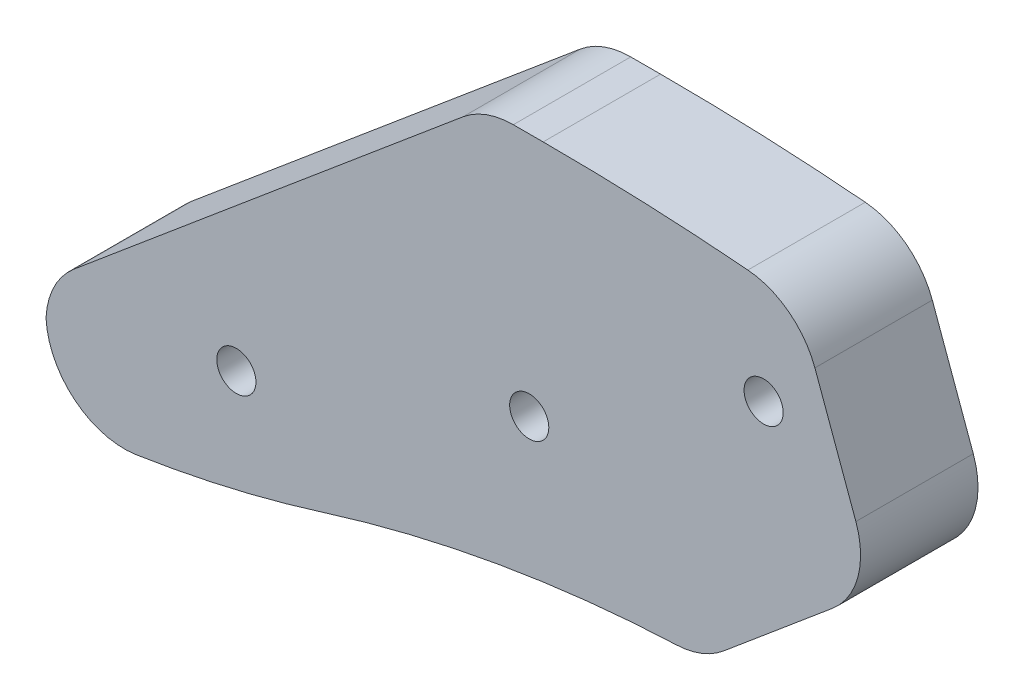
ISO-10303-21;
HEADER;
FILE_DESCRIPTION(('STEP AP214'),'2;1');
FILE_NAME('part.step','',(''),(''),'','','');
FILE_SCHEMA(('AUTOMOTIVE_DESIGN { 1 0 10303 214 1 1 1 1 }'));
ENDSEC;
DATA;
#1=APPLICATION_CONTEXT('core data for automotive mechanical design processes');
#2=APPLICATION_PROTOCOL_DEFINITION('international standard','automotive_design',2000,#1);
#3=PRODUCT_CONTEXT('',#1,'mechanical');
#4=PRODUCT('Part','Part','',(#3));
#5=PRODUCT_RELATED_PRODUCT_CATEGORY('part','',(#4));
#6=PRODUCT_DEFINITION_FORMATION('','',#4);
#7=PRODUCT_DEFINITION_CONTEXT('part definition',#1,'design');
#8=PRODUCT_DEFINITION('design','',#6,#7);
#9=PRODUCT_DEFINITION_SHAPE('','',#8);
#10=(LENGTH_UNIT() NAMED_UNIT(*) SI_UNIT(.MILLI.,.METRE.));
#11=(NAMED_UNIT(*) PLANE_ANGLE_UNIT() SI_UNIT($,.RADIAN.));
#12=(NAMED_UNIT(*) SI_UNIT($,.STERADIAN.) SOLID_ANGLE_UNIT());
#13=UNCERTAINTY_MEASURE_WITH_UNIT(LENGTH_MEASURE(1.E-05),#10,'distance_accuracy_value','');
#14=(GEOMETRIC_REPRESENTATION_CONTEXT(3) GLOBAL_UNCERTAINTY_ASSIGNED_CONTEXT((#13)) GLOBAL_UNIT_ASSIGNED_CONTEXT((#10,
#11,#12)) REPRESENTATION_CONTEXT('',''));
#15=CARTESIAN_POINT('',(0.,0.,0.));
#16=DIRECTION('',(0.,0.,1.));
#17=DIRECTION('',(1.,0.,0.));
#18=AXIS2_PLACEMENT_3D('',#15,#16,#17);
#19=CARTESIAN_POINT('',(0.,105.,-12.));
#20=DIRECTION('',(0.,0.,1.));
#21=DIRECTION('',(-1.,0.,0.));
#22=AXIS2_PLACEMENT_3D('',#19,#20,#21);
#23=CYLINDRICAL_SURFACE('',#22,130.);
#24=CARTESIAN_POINT('',(0.,105.,-12.));
#25=DIRECTION('',(0.,0.,1.));
#26=DIRECTION('',(1.,0.,0.));
#27=AXIS2_PLACEMENT_3D('',#24,#25,#26);
#28=CIRCLE('',#27,130.);
#29=CARTESIAN_POINT('',(38.9734253468667,-19.0204503972317,-12.));
#30=VERTEX_POINT('',#29);
#31=CARTESIAN_POINT('',(19.8260608424396,-23.4792874804024,-12.));
#32=VERTEX_POINT('',#31);
#33=EDGE_CURVE('E147',#30,#32,#28,.F.);
#34=ORIENTED_EDGE('',*,*,#33,.F.);
#35=DIRECTION('',(0.,0.,1.));
#36=VECTOR('',#35,1.);
#37=CARTESIAN_POINT('',(38.9734253468667,-19.0204503972317,-12.));
#38=LINE('',#37,#36);
#39=CARTESIAN_POINT('',(38.9734253468667,-19.0204503972317,0.));
#40=VERTEX_POINT('',#39);
#41=EDGE_CURVE('E156',#30,#40,#38,.T.);
#42=ORIENTED_EDGE('',*,*,#41,.T.);
#43=CARTESIAN_POINT('',(0.,105.,0.));
#44=DIRECTION('',(0.,0.,1.));
#45=DIRECTION('',(1.,0.,0.));
#46=AXIS2_PLACEMENT_3D('',#43,#44,#45);
#47=CIRCLE('',#46,130.);
#48=CARTESIAN_POINT('',(19.8260608424396,-23.4792874804024,0.));
#49=VERTEX_POINT('',#48);
#50=EDGE_CURVE('E189',#40,#49,#47,.F.);
#51=ORIENTED_EDGE('',*,*,#50,.T.);
#52=DIRECTION('',(0.,0.,1.));
#53=VECTOR('',#52,1.);
#54=CARTESIAN_POINT('',(19.8260608424396,-23.4792874804024,-12.));
#55=LINE('',#54,#53);
#56=EDGE_CURVE('E56',#32,#49,#55,.T.);
#57=ORIENTED_EDGE('',*,*,#56,.F.);
#58=EDGE_LOOP('',(#34,#42,#51,#57));
#59=FACE_BOUND('',#58,.T.);
#60=ADVANCED_FACE('F47',(#59),#23,.T.);
#61=CARTESIAN_POINT('',(80.9448064896462,-152.580935440404,-12.));
#62=DIRECTION('',(0.,0.,1.));
#63=DIRECTION('',(-1.,0.,0.));
#64=AXIS2_PLACEMENT_3D('',#61,#62,#63);
#65=CYLINDRICAL_SURFACE('',#64,140.);
#66=CARTESIAN_POINT('',(80.9448064896462,-152.580935440404,0.));
#67=DIRECTION('',(0.,0.,1.));
#68=DIRECTION('',(1.,0.,0.));
#69=AXIS2_PLACEMENT_3D('',#66,#67,#68);
#70=CIRCLE('',#69,140.);
#71=CARTESIAN_POINT('',(75.0501211789856,-12.7050880431918,0.));
#72=VERTEX_POINT('',#71);
#73=EDGE_CURVE('E159',#40,#72,#70,.F.);
#74=ORIENTED_EDGE('',*,*,#73,.F.);
#75=ORIENTED_EDGE('',*,*,#41,.F.);
#76=CARTESIAN_POINT('',(80.9448064896462,-152.580935440404,-12.));
#77=DIRECTION('',(0.,0.,1.));
#78=DIRECTION('',(1.,0.,0.));
#79=AXIS2_PLACEMENT_3D('',#76,#77,#78);
#80=CIRCLE('',#79,140.);
#81=CARTESIAN_POINT('',(75.0501211789856,-12.7050880431918,-12.));
#82=VERTEX_POINT('',#81);
#83=EDGE_CURVE('E142',#30,#82,#80,.F.);
#84=ORIENTED_EDGE('',*,*,#83,.T.);
#85=DIRECTION('',(0.,0.,1.));
#86=VECTOR('',#85,1.);
#87=CARTESIAN_POINT('',(75.0501211789856,-12.7050880431918,-12.));
#88=LINE('',#87,#86);
#89=EDGE_CURVE('E246',#72,#82,#88,.F.);
#90=ORIENTED_EDGE('',*,*,#89,.F.);
#91=EDGE_LOOP('',(#74,#75,#84,#90));
#92=FACE_BOUND('',#91,.T.);
#93=ADVANCED_FACE('F157',(#92),#65,.F.);
#94=CARTESIAN_POINT('',(38.33232617047,-45.6826874261504,-12.));
#95=DIRECTION('',(0.642787609686541,-0.766044443118977,0.));
#96=DIRECTION('',(0.766044443118976,0.642787609686541,0.));
#97=AXIS2_PLACEMENT_3D('',#94,#95,#96);
#98=PLANE('',#97);
#99=DIRECTION('',(-0.766044443118977,-0.642787609686541,0.));
#100=VECTOR('',#99,1.);
#101=CARTESIAN_POINT('',(38.33232617047,-45.6826874261504,0.));
#102=LINE('',#101,#100);
#103=CARTESIAN_POINT('',(91.0061056521809,-1.48413849033324,0.));
#104=VERTEX_POINT('',#103);
#105=CARTESIAN_POINT('',(79.8555828958688,-10.8405380225886,0.));
#106=VERTEX_POINT('',#105);
#107=EDGE_CURVE('E193',#104,#106,#102,.T.);
#108=ORIENTED_EDGE('',*,*,#107,.T.);
#109=DIRECTION('',(0.,0.,-1.));
#110=VECTOR('',#109,1.);
#111=CARTESIAN_POINT('',(79.8555828958688,-10.8405380225886,0.));
#112=LINE('',#111,#110);
#113=CARTESIAN_POINT('',(79.8555828958688,-10.8405380225886,-12.));
#114=VERTEX_POINT('',#113);
#115=EDGE_CURVE('E240',#114,#106,#112,.F.);
#116=ORIENTED_EDGE('',*,*,#115,.F.);
#117=DIRECTION('',(-0.766044443118977,-0.642787609686541,0.));
#118=VECTOR('',#117,1.);
#119=CARTESIAN_POINT('',(38.33232617047,-45.6826874261504,-12.));
#120=LINE('',#119,#118);
#121=CARTESIAN_POINT('',(91.0061056521809,-1.48413849033324,-12.));
#122=VERTEX_POINT('',#121);
#123=EDGE_CURVE('E153',#122,#114,#120,.T.);
#124=ORIENTED_EDGE('',*,*,#123,.F.);
#125=DIRECTION('',(0.,0.,1.));
#126=VECTOR('',#125,1.);
#127=CARTESIAN_POINT('',(91.0061056521809,-1.48413849033324,-12.));
#128=LINE('',#127,#126);
#129=EDGE_CURVE('E243',#104,#122,#128,.F.);
#130=ORIENTED_EDGE('',*,*,#129,.F.);
#131=EDGE_LOOP('',(#108,#116,#124,#130));
#132=FACE_BOUND('',#131,.T.);
#133=ADVANCED_FACE('F303',(#132),#98,.T.);
#134=CARTESIAN_POINT('',(84.829811199685,30.8755262551069,-12.));
#135=DIRECTION('',(-0.939692620785909,-0.342020143325667,0.));
#136=DIRECTION('',(0.342020143325667,-0.939692620785909,0.));
#137=AXIS2_PLACEMENT_3D('',#134,#135,#136);
#138=PLANE('',#137);
#139=DIRECTION('',(-0.342020143325667,0.939692620785909,0.));
#140=VECTOR('',#139,1.);
#141=CARTESIAN_POINT('',(84.829811199685,30.8755262551069,-12.));
#142=LINE('',#141,#140);
#143=CARTESIAN_POINT('',(93.3813457409758,7.38037820122391,-12.));
#144=VERTEX_POINT('',#143);
#145=CARTESIAN_POINT('',(89.1931963838394,18.8872239892596,-12.));
#146=VERTEX_POINT('',#145);
#147=EDGE_CURVE('E178',#144,#146,#142,.T.);
#148=ORIENTED_EDGE('',*,*,#147,.T.);
#149=DIRECTION('',(0.,0.,-1.));
#150=VECTOR('',#149,1.);
#151=CARTESIAN_POINT('',(89.1931963838394,18.8872239892596,-12.));
#152=LINE('',#151,#150);
#153=CARTESIAN_POINT('',(89.1931963838394,18.8872239892596,0.));
#154=VERTEX_POINT('',#153);
#155=EDGE_CURVE('E235',#154,#146,#152,.T.);
#156=ORIENTED_EDGE('',*,*,#155,.F.);
#157=DIRECTION('',(-0.342020143325667,0.939692620785909,0.));
#158=VECTOR('',#157,1.);
#159=CARTESIAN_POINT('',(84.829811199685,30.8755262551069,0.));
#160=LINE('',#159,#158);
#161=CARTESIAN_POINT('',(93.3813457409758,7.38037820122391,0.));
#162=VERTEX_POINT('',#161);
#163=EDGE_CURVE('E196',#162,#154,#160,.T.);
#164=ORIENTED_EDGE('',*,*,#163,.F.);
#165=DIRECTION('',(0.,0.,1.));
#166=VECTOR('',#165,1.);
#167=CARTESIAN_POINT('',(93.3813457409758,7.38037820122391,0.));
#168=LINE('',#167,#166);
#169=EDGE_CURVE('E237',#144,#162,#168,.T.);
#170=ORIENTED_EDGE('',*,*,#169,.F.);
#171=EDGE_LOOP('',(#148,#156,#164,#170));
#172=FACE_BOUND('',#171,.T.);
#173=ADVANCED_FACE('F375',(#172),#138,.F.);
#174=CARTESIAN_POINT('',(61.4231274307002,-225.,-12.));
#175=DIRECTION('',(0.,0.,1.));
#176=DIRECTION('',(-1.,0.,0.));
#177=AXIS2_PLACEMENT_3D('',#174,#175,#176);
#178=CYLINDRICAL_SURFACE('',#177,250.);
#179=CARTESIAN_POINT('',(61.4231274307002,-225.,-12.));
#180=DIRECTION('',(0.,0.,1.));
#181=DIRECTION('',(1.,0.,0.));
#182=AXIS2_PLACEMENT_3D('',#179,#180,#181);
#183=CIRCLE('',#182,250.);
#184=CARTESIAN_POINT('',(61.4231274307002,25.,-12.));
#185=VERTEX_POINT('',#184);
#186=CARTESIAN_POINT('',(82.3451604749688,24.1229988043949,-12.));
#187=VERTEX_POINT('',#186);
#188=EDGE_CURVE('E181',#185,#187,#183,.F.);
#189=ORIENTED_EDGE('',*,*,#188,.F.);
#190=DIRECTION('',(0.,0.,1.));
#191=VECTOR('',#190,1.);
#192=CARTESIAN_POINT('',(61.4231274307002,25.,-12.));
#193=LINE('',#192,#191);
#194=CARTESIAN_POINT('',(61.4231274307002,25.,0.));
#195=VERTEX_POINT('',#194);
#196=EDGE_CURVE('E164',#185,#195,#193,.T.);
#197=ORIENTED_EDGE('',*,*,#196,.T.);
#198=CARTESIAN_POINT('',(61.4231274307002,-225.,0.));
#199=DIRECTION('',(0.,0.,1.));
#200=DIRECTION('',(1.,0.,0.));
#201=AXIS2_PLACEMENT_3D('',#198,#199,#200);
#202=CIRCLE('',#201,250.);
#203=CARTESIAN_POINT('',(82.3451604749688,24.1229988043949,0.));
#204=VERTEX_POINT('',#203);
#205=EDGE_CURVE('E199',#195,#204,#202,.F.);
#206=ORIENTED_EDGE('',*,*,#205,.T.);
#207=DIRECTION('',(0.,0.,1.));
#208=VECTOR('',#207,1.);
#209=CARTESIAN_POINT('',(82.3451604749688,24.1229988043949,-12.));
#210=LINE('',#209,#208);
#211=EDGE_CURVE('E11',#187,#204,#210,.T.);
#212=ORIENTED_EDGE('',*,*,#211,.F.);
#213=EDGE_LOOP('',(#189,#197,#206,#212));
#214=FACE_BOUND('',#213,.T.);
#215=ADVANCED_FACE('F366',(#214),#178,.T.);
#216=CARTESIAN_POINT('',(0.,25.,-12.));
#217=DIRECTION('',(0.,1.,0.));
#218=DIRECTION('',(0.,0.,-1.));
#219=AXIS2_PLACEMENT_3D('',#216,#217,#218);
#220=PLANE('',#219);
#221=DIRECTION('',(1.,0.,0.));
#222=VECTOR('',#221,1.);
#223=CARTESIAN_POINT('',(0.,25.,0.));
#224=LINE('',#223,#222);
#225=CARTESIAN_POINT('',(58.3750448321815,25.,0.));
#226=VERTEX_POINT('',#225);
#227=EDGE_CURVE('E171',#226,#195,#224,.T.);
#228=ORIENTED_EDGE('',*,*,#227,.T.);
#229=ORIENTED_EDGE('',*,*,#196,.F.);
#230=DIRECTION('',(1.,0.,0.));
#231=VECTOR('',#230,1.);
#232=CARTESIAN_POINT('',(0.,25.,-12.));
#233=LINE('',#232,#231);
#234=CARTESIAN_POINT('',(58.3750448321815,25.,-12.));
#235=VERTEX_POINT('',#234);
#236=EDGE_CURVE('E184',#235,#185,#233,.T.);
#237=ORIENTED_EDGE('',*,*,#236,.F.);
#238=DIRECTION('',(0.,0.,1.));
#239=VECTOR('',#238,1.);
#240=CARTESIAN_POINT('',(58.3750448321815,25.,-12.));
#241=LINE('',#240,#239);
#242=EDGE_CURVE('E222',#226,#235,#241,.F.);
#243=ORIENTED_EDGE('',*,*,#242,.F.);
#244=EDGE_LOOP('',(#228,#229,#237,#243));
#245=FACE_BOUND('',#244,.T.);
#246=ADVANCED_FACE('F358',(#245),#220,.T.);
#247=CARTESIAN_POINT('',(10.6059955598279,-12.6397333114631,-12.));
#248=DIRECTION('',(-0.642787609686541,0.766044443118977,0.));
#249=DIRECTION('',(-0.766044443118977,-0.642787609686541,0.));
#250=AXIS2_PLACEMENT_3D('',#247,#248,#249);
#251=PLANE('',#250);
#252=DIRECTION('',(0.766044443118977,0.642787609686541,0.));
#253=VECTOR('',#252,1.);
#254=CARTESIAN_POINT('',(10.6059955598279,-12.6397333114631,-12.));
#255=LINE('',#254,#253);
#256=CARTESIAN_POINT('',(13.4636946823356,-10.2418390317513,-12.));
#257=VERTEX_POINT('',#256);
#258=CARTESIAN_POINT('',(53.2327439546892,23.1283555449518,-12.));
#259=VERTEX_POINT('',#258);
#260=EDGE_CURVE('E186',#257,#259,#255,.T.);
#261=ORIENTED_EDGE('',*,*,#260,.F.);
#262=DIRECTION('',(0.,0.,1.));
#263=VECTOR('',#262,1.);
#264=CARTESIAN_POINT('',(13.4636946823356,-10.2418390317513,-12.));
#265=LINE('',#264,#263);
#266=CARTESIAN_POINT('',(13.4636946823356,-10.2418390317513,0.));
#267=VERTEX_POINT('',#266);
#268=EDGE_CURVE('E163',#267,#257,#265,.F.);
#269=ORIENTED_EDGE('',*,*,#268,.F.);
#270=DIRECTION('',(0.766044443118977,0.642787609686541,0.));
#271=VECTOR('',#270,1.);
#272=CARTESIAN_POINT('',(10.6059955598279,-12.6397333114631,0.));
#273=LINE('',#272,#271);
#274=CARTESIAN_POINT('',(53.2327439546892,23.1283555449518,0.));
#275=VERTEX_POINT('',#274);
#276=EDGE_CURVE('E168',#267,#275,#273,.T.);
#277=ORIENTED_EDGE('',*,*,#276,.T.);
#278=DIRECTION('',(0.,0.,1.));
#279=VECTOR('',#278,1.);
#280=CARTESIAN_POINT('',(53.2327439546892,23.1283555449518,-12.));
#281=LINE('',#280,#279);
#282=EDGE_CURVE('E207',#259,#275,#281,.T.);
#283=ORIENTED_EDGE('',*,*,#282,.F.);
#284=EDGE_LOOP('',(#261,#269,#277,#283));
#285=FACE_BOUND('',#284,.T.);
#286=ADVANCED_FACE('F294',(#285),#251,.T.);
#287=CARTESIAN_POINT('',(0.,0.,-12.));
#288=DIRECTION('',(0.,0.,-1.));
#289=DIRECTION('',(1.,0.,0.));
#290=AXIS2_PLACEMENT_3D('',#287,#288,#289);
#291=PLANE('',#290);
#292=CARTESIAN_POINT('',(83.9535089505867,13.2969295284196,-12.));
#293=DIRECTION('',(0.,0.,1.));
#294=DIRECTION('',(1.,0.,0.));
#295=AXIS2_PLACEMENT_3D('',#292,#293,#294);
#296=CIRCLE('',#295,2.);
#297=CARTESIAN_POINT('',(85.9535089505867,13.2969295284196,-12.));
#298=VERTEX_POINT('',#297);
#299=EDGE_CURVE('E259',#298,#298,#296,.T.);
#300=ORIENTED_EDGE('',*,*,#299,.T.);
#301=EDGE_LOOP('',(#300));
#302=FACE_BOUND('',#301,.T.);
#303=CARTESIAN_POINT('',(30.0701638651491,-10.9446445864214,-12.));
#304=DIRECTION('',(0.,0.,1.));
#305=DIRECTION('',(1.,0.,0.));
#306=AXIS2_PLACEMENT_3D('',#303,#304,#305);
#307=CIRCLE('',#306,2.);
#308=CARTESIAN_POINT('',(32.0701638651491,-10.9446445864214,-12.));
#309=VERTEX_POINT('',#308);
#310=EDGE_CURVE('E271',#309,#309,#307,.T.);
#311=ORIENTED_EDGE('',*,*,#310,.T.);
#312=EDGE_LOOP('',(#311));
#313=FACE_BOUND('',#312,.T.);
#314=CARTESIAN_POINT('',(60.,0.,-12.));
#315=DIRECTION('',(0.,0.,1.));
#316=DIRECTION('',(1.,0.,0.));
#317=AXIS2_PLACEMENT_3D('',#314,#315,#316);
#318=CIRCLE('',#317,2.);
#319=CARTESIAN_POINT('',(62.,0.,-12.));
#320=VERTEX_POINT('',#319);
#321=EDGE_CURVE('E174',#320,#320,#318,.T.);
#322=ORIENTED_EDGE('',*,*,#321,.T.);
#323=EDGE_LOOP('',(#322));
#324=FACE_BOUND('',#323,.T.);
#325=ORIENTED_EDGE('',*,*,#236,.T.);
#326=ORIENTED_EDGE('',*,*,#188,.T.);
#327=CARTESIAN_POINT('',(81.6756554175522,16.1510628426542,-12.));
#328=DIRECTION('',(0.,0.,1.));
#329=DIRECTION('',(1.,0.,0.));
#330=AXIS2_PLACEMENT_3D('',#327,#328,#329);
#331=CIRCLE('',#330,8.);
#332=EDGE_CURVE('E69',#146,#187,#331,.T.);
#333=ORIENTED_EDGE('',*,*,#332,.F.);
#334=ORIENTED_EDGE('',*,*,#147,.F.);
#335=CARTESIAN_POINT('',(85.8638047746885,4.64421705461858,-12.));
#336=DIRECTION('',(0.,0.,1.));
#337=DIRECTION('',(1.,0.,0.));
#338=AXIS2_PLACEMENT_3D('',#335,#336,#337);
#339=CIRCLE('',#338,8.);
#340=EDGE_CURVE('E231',#122,#144,#339,.T.);
#341=ORIENTED_EDGE('',*,*,#340,.F.);
#342=ORIENTED_EDGE('',*,*,#123,.T.);
#343=CARTESIAN_POINT('',(74.7132820183765,-4.71218247763674,-12.));
#344=DIRECTION('',(0.,0.,1.));
#345=DIRECTION('',(1.,0.,0.));
#346=AXIS2_PLACEMENT_3D('',#343,#344,#345);
#347=CIRCLE('',#346,8.);
#348=EDGE_CURVE('E149',#82,#114,#347,.T.);
#349=ORIENTED_EDGE('',*,*,#348,.F.);
#350=ORIENTED_EDGE('',*,*,#83,.F.);
#351=ORIENTED_EDGE('',*,*,#33,.T.);
#352=CARTESIAN_POINT('',(18.6059955598279,-15.5728697893007,-12.));
#353=DIRECTION('',(0.,0.,1.));
#354=DIRECTION('',(1.,0.,0.));
#355=AXIS2_PLACEMENT_3D('',#352,#353,#354);
#356=CIRCLE('',#355,8.);
#357=CARTESIAN_POINT('',(10.6159349658244,-15.9715321830019,-12.));
#358=VERTEX_POINT('',#357);
#359=EDGE_CURVE('E228',#358,#32,#356,.T.);
#360=ORIENTED_EDGE('',*,*,#359,.F.);
#361=CARTESIAN_POINT('',(18.6059955598279,-16.3701945767031,-12.));
#362=DIRECTION('',(0.,0.,1.));
#363=DIRECTION('',(1.,0.,0.));
#364=AXIS2_PLACEMENT_3D('',#361,#362,#363);
#365=CIRCLE('',#364,8.);
#366=EDGE_CURVE('E226',#257,#358,#365,.T.);
#367=ORIENTED_EDGE('',*,*,#366,.F.);
#368=ORIENTED_EDGE('',*,*,#260,.T.);
#369=CARTESIAN_POINT('',(58.3750448321815,17.,-12.));
#370=DIRECTION('',(0.,0.,1.));
#371=DIRECTION('',(1.,0.,0.));
#372=AXIS2_PLACEMENT_3D('',#369,#370,#371);
#373=CIRCLE('',#372,8.);
#374=EDGE_CURVE('E233',#235,#259,#373,.T.);
#375=ORIENTED_EDGE('',*,*,#374,.F.);
#376=EDGE_LOOP('',(#325,#326,#333,#334,#341,#342,#349,#350,#351,#360,#367,#368,#375));
#377=FACE_BOUND('',#376,.T.);
#378=ADVANCED_FACE('F144',(#302,#313,#324,#377),#291,.T.);
#379=CARTESIAN_POINT('',(0.,0.,0.));
#380=DIRECTION('',(0.,0.,-1.));
#381=DIRECTION('',(1.,0.,0.));
#382=AXIS2_PLACEMENT_3D('',#379,#380,#381);
#383=PLANE('',#382);
#384=CARTESIAN_POINT('',(83.9535089505867,13.2969295284196,0.));
#385=DIRECTION('',(0.,0.,1.));
#386=DIRECTION('',(1.,0.,0.));
#387=AXIS2_PLACEMENT_3D('',#384,#385,#386);
#388=CIRCLE('',#387,2.);
#389=CARTESIAN_POINT('',(85.9535089505867,13.2969295284196,0.));
#390=VERTEX_POINT('',#389);
#391=EDGE_CURVE('E257',#390,#390,#388,.T.);
#392=ORIENTED_EDGE('',*,*,#391,.F.);
#393=EDGE_LOOP('',(#392));
#394=FACE_BOUND('',#393,.T.);
#395=CARTESIAN_POINT('',(30.0701638651491,-10.9446445864214,0.));
#396=DIRECTION('',(0.,0.,1.));
#397=DIRECTION('',(1.,0.,0.));
#398=AXIS2_PLACEMENT_3D('',#395,#396,#397);
#399=CIRCLE('',#398,2.);
#400=CARTESIAN_POINT('',(32.0701638651491,-10.9446445864214,0.));
#401=VERTEX_POINT('',#400);
#402=EDGE_CURVE('E264',#401,#401,#399,.T.);
#403=ORIENTED_EDGE('',*,*,#402,.F.);
#404=EDGE_LOOP('',(#403));
#405=FACE_BOUND('',#404,.T.);
#406=CARTESIAN_POINT('',(60.,0.,0.));
#407=DIRECTION('',(0.,0.,1.));
#408=DIRECTION('',(1.,0.,0.));
#409=AXIS2_PLACEMENT_3D('',#406,#407,#408);
#410=CIRCLE('',#409,2.);
#411=CARTESIAN_POINT('',(62.,0.,0.));
#412=VERTEX_POINT('',#411);
#413=EDGE_CURVE('E191',#412,#412,#410,.T.);
#414=ORIENTED_EDGE('',*,*,#413,.F.);
#415=EDGE_LOOP('',(#414));
#416=FACE_BOUND('',#415,.T.);
#417=ORIENTED_EDGE('',*,*,#276,.F.);
#418=CARTESIAN_POINT('',(18.6059955598279,-16.3701945767031,0.));
#419=DIRECTION('',(0.,0.,1.));
#420=DIRECTION('',(1.,0.,0.));
#421=AXIS2_PLACEMENT_3D('',#418,#419,#420);
#422=CIRCLE('',#421,8.);
#423=CARTESIAN_POINT('',(10.6159349658244,-15.9715321830019,0.));
#424=VERTEX_POINT('',#423);
#425=EDGE_CURVE('E212',#424,#267,#422,.F.);
#426=ORIENTED_EDGE('',*,*,#425,.F.);
#427=CARTESIAN_POINT('',(18.6059955598279,-15.5728697893007,0.));
#428=DIRECTION('',(0.,0.,1.));
#429=DIRECTION('',(1.,0.,0.));
#430=AXIS2_PLACEMENT_3D('',#427,#428,#429);
#431=CIRCLE('',#430,8.);
#432=EDGE_CURVE('E214',#49,#424,#431,.F.);
#433=ORIENTED_EDGE('',*,*,#432,.F.);
#434=ORIENTED_EDGE('',*,*,#50,.F.);
#435=ORIENTED_EDGE('',*,*,#73,.T.);
#436=CARTESIAN_POINT('',(74.7132820183765,-4.71218247763674,0.));
#437=DIRECTION('',(0.,0.,1.));
#438=DIRECTION('',(1.,0.,0.));
#439=AXIS2_PLACEMENT_3D('',#436,#437,#438);
#440=CIRCLE('',#439,8.);
#441=EDGE_CURVE('E216',#106,#72,#440,.F.);
#442=ORIENTED_EDGE('',*,*,#441,.F.);
#443=ORIENTED_EDGE('',*,*,#107,.F.);
#444=CARTESIAN_POINT('',(85.8638047746885,4.64421705461858,0.));
#445=DIRECTION('',(0.,0.,1.));
#446=DIRECTION('',(1.,0.,0.));
#447=AXIS2_PLACEMENT_3D('',#444,#445,#446);
#448=CIRCLE('',#447,8.);
#449=EDGE_CURVE('E218',#162,#104,#448,.F.);
#450=ORIENTED_EDGE('',*,*,#449,.F.);
#451=ORIENTED_EDGE('',*,*,#163,.T.);
#452=CARTESIAN_POINT('',(81.6756554175522,16.1510628426542,0.));
#453=DIRECTION('',(0.,0.,1.));
#454=DIRECTION('',(1.,0.,0.));
#455=AXIS2_PLACEMENT_3D('',#452,#453,#454);
#456=CIRCLE('',#455,8.);
#457=EDGE_CURVE('E210',#204,#154,#456,.F.);
#458=ORIENTED_EDGE('',*,*,#457,.F.);
#459=ORIENTED_EDGE('',*,*,#205,.F.);
#460=ORIENTED_EDGE('',*,*,#227,.F.);
#461=CARTESIAN_POINT('',(58.3750448321815,17.,0.));
#462=DIRECTION('',(0.,0.,1.));
#463=DIRECTION('',(1.,0.,0.));
#464=AXIS2_PLACEMENT_3D('',#461,#462,#463);
#465=CIRCLE('',#464,8.);
#466=EDGE_CURVE('E220',#275,#226,#465,.F.);
#467=ORIENTED_EDGE('',*,*,#466,.F.);
#468=EDGE_LOOP('',(#417,#426,#433,#434,#435,#442,#443,#450,#451,#458,#459,#460,#467));
#469=FACE_BOUND('',#468,.T.);
#470=ADVANCED_FACE('F252',(#394,#405,#416,#469),#383,.F.);
#471=CARTESIAN_POINT('',(60.,0.,0.));
#472=DIRECTION('',(0.,0.,-1.));
#473=DIRECTION('',(1.,0.,0.));
#474=AXIS2_PLACEMENT_3D('',#471,#472,#473);
#475=CYLINDRICAL_SURFACE('',#474,2.);
#476=ORIENTED_EDGE('',*,*,#413,.T.);
#477=EDGE_LOOP('',(#476));
#478=FACE_BOUND('',#477,.T.);
#479=ORIENTED_EDGE('',*,*,#321,.F.);
#480=EDGE_LOOP('',(#479));
#481=FACE_BOUND('',#480,.T.);
#482=ADVANCED_FACE('F286',(#478,#481),#475,.F.);
#483=CARTESIAN_POINT('',(30.0701638651491,-10.9446445864214,0.));
#484=DIRECTION('',(0.,0.,-1.));
#485=DIRECTION('',(1.,0.,0.));
#486=AXIS2_PLACEMENT_3D('',#483,#484,#485);
#487=CYLINDRICAL_SURFACE('',#486,2.);
#488=ORIENTED_EDGE('',*,*,#402,.T.);
#489=EDGE_LOOP('',(#488));
#490=FACE_BOUND('',#489,.T.);
#491=ORIENTED_EDGE('',*,*,#310,.F.);
#492=EDGE_LOOP('',(#491));
#493=FACE_BOUND('',#492,.T.);
#494=ADVANCED_FACE('F281',(#490,#493),#487,.F.);
#495=CARTESIAN_POINT('',(83.9535089505867,13.2969295284196,0.));
#496=DIRECTION('',(0.,0.,-1.));
#497=DIRECTION('',(1.,0.,0.));
#498=AXIS2_PLACEMENT_3D('',#495,#496,#497);
#499=CYLINDRICAL_SURFACE('',#498,2.);
#500=ORIENTED_EDGE('',*,*,#391,.T.);
#501=EDGE_LOOP('',(#500));
#502=FACE_BOUND('',#501,.T.);
#503=ORIENTED_EDGE('',*,*,#299,.F.);
#504=EDGE_LOOP('',(#503));
#505=FACE_BOUND('',#504,.T.);
#506=ADVANCED_FACE('F311',(#502,#505),#499,.F.);
#507=CARTESIAN_POINT('',(58.3750448321815,17.,-12.));
#508=DIRECTION('',(0.,0.,1.));
#509=DIRECTION('',(-1.,0.,0.));
#510=AXIS2_PLACEMENT_3D('',#507,#508,#509);
#511=CYLINDRICAL_SURFACE('',#510,8.);
#512=ORIENTED_EDGE('',*,*,#374,.T.);
#513=ORIENTED_EDGE('',*,*,#282,.T.);
#514=ORIENTED_EDGE('',*,*,#466,.T.);
#515=ORIENTED_EDGE('',*,*,#242,.T.);
#516=EDGE_LOOP('',(#512,#513,#514,#515));
#517=FACE_BOUND('',#516,.T.);
#518=ADVANCED_FACE('F307',(#517),#511,.T.);
#519=CARTESIAN_POINT('',(85.8638047746885,4.64421705461858,-12.));
#520=DIRECTION('',(0.,0.,-1.));
#521=DIRECTION('',(1.,0.,0.));
#522=AXIS2_PLACEMENT_3D('',#519,#520,#521);
#523=CYLINDRICAL_SURFACE('',#522,8.);
#524=ORIENTED_EDGE('',*,*,#340,.T.);
#525=ORIENTED_EDGE('',*,*,#169,.T.);
#526=ORIENTED_EDGE('',*,*,#449,.T.);
#527=ORIENTED_EDGE('',*,*,#129,.T.);
#528=EDGE_LOOP('',(#524,#525,#526,#527));
#529=FACE_BOUND('',#528,.T.);
#530=ADVANCED_FACE('F310',(#529),#523,.T.);
#531=CARTESIAN_POINT('',(74.7132820183765,-4.71218247763674,-12.));
#532=DIRECTION('',(0.,0.,1.));
#533=DIRECTION('',(-1.,0.,0.));
#534=AXIS2_PLACEMENT_3D('',#531,#532,#533);
#535=CYLINDRICAL_SURFACE('',#534,8.);
#536=ORIENTED_EDGE('',*,*,#348,.T.);
#537=ORIENTED_EDGE('',*,*,#115,.T.);
#538=ORIENTED_EDGE('',*,*,#441,.T.);
#539=ORIENTED_EDGE('',*,*,#89,.T.);
#540=EDGE_LOOP('',(#536,#537,#538,#539));
#541=FACE_BOUND('',#540,.T.);
#542=ADVANCED_FACE('F315',(#541),#535,.T.);
#543=CARTESIAN_POINT('',(18.6059955598279,-16.3701945767031,-12.));
#544=DIRECTION('',(0.,0.,-1.));
#545=DIRECTION('',(1.,0.,0.));
#546=AXIS2_PLACEMENT_3D('',#543,#544,#545);
#547=CYLINDRICAL_SURFACE('',#546,8.);
#548=DIRECTION('',(0.,0.,-1.));
#549=VECTOR('',#548,1.);
#550=CARTESIAN_POINT('',(10.6159349658244,-15.9715321830019,-6.));
#551=LINE('',#550,#549);
#552=EDGE_CURVE('E51',#358,#424,#551,.F.);
#553=ORIENTED_EDGE('',*,*,#552,.T.);
#554=ORIENTED_EDGE('',*,*,#425,.T.);
#555=ORIENTED_EDGE('',*,*,#268,.T.);
#556=ORIENTED_EDGE('',*,*,#366,.T.);
#557=EDGE_LOOP('',(#553,#554,#555,#556));
#558=FACE_BOUND('',#557,.T.);
#559=ADVANCED_FACE('F255',(#558),#547,.T.);
#560=CARTESIAN_POINT('',(18.6059955598279,-15.5728697893007,-12.));
#561=DIRECTION('',(0.,0.,1.));
#562=DIRECTION('',(-1.,0.,0.));
#563=AXIS2_PLACEMENT_3D('',#560,#561,#562);
#564=CYLINDRICAL_SURFACE('',#563,8.);
#565=ORIENTED_EDGE('',*,*,#359,.T.);
#566=ORIENTED_EDGE('',*,*,#56,.T.);
#567=ORIENTED_EDGE('',*,*,#432,.T.);
#568=ORIENTED_EDGE('',*,*,#552,.F.);
#569=EDGE_LOOP('',(#565,#566,#567,#568));
#570=FACE_BOUND('',#569,.T.);
#571=ADVANCED_FACE('F248',(#570),#564,.T.);
#572=CARTESIAN_POINT('',(81.6756554175522,16.1510628426542,-12.));
#573=DIRECTION('',(0.,0.,1.));
#574=DIRECTION('',(-1.,0.,0.));
#575=AXIS2_PLACEMENT_3D('',#572,#573,#574);
#576=CYLINDRICAL_SURFACE('',#575,8.);
#577=ORIENTED_EDGE('',*,*,#332,.T.);
#578=ORIENTED_EDGE('',*,*,#211,.T.);
#579=ORIENTED_EDGE('',*,*,#457,.T.);
#580=ORIENTED_EDGE('',*,*,#155,.T.);
#581=EDGE_LOOP('',(#577,#578,#579,#580));
#582=FACE_BOUND('',#581,.T.);
#583=ADVANCED_FACE('F49',(#582),#576,.T.);
#584=CLOSED_SHELL('',(#60,#93,#133,#173,#215,#246,#286,#378,#470,#482,#494,#506,#518,#530,#542,
#559,#571,#583));
#585=MANIFOLD_SOLID_BREP('B2',#584);
#586=ADVANCED_BREP_SHAPE_REPRESENTATION('',(#18,#585),#14);
#587=SHAPE_DEFINITION_REPRESENTATION(#9,#586);
ENDSEC;
END-ISO-10303-21;
